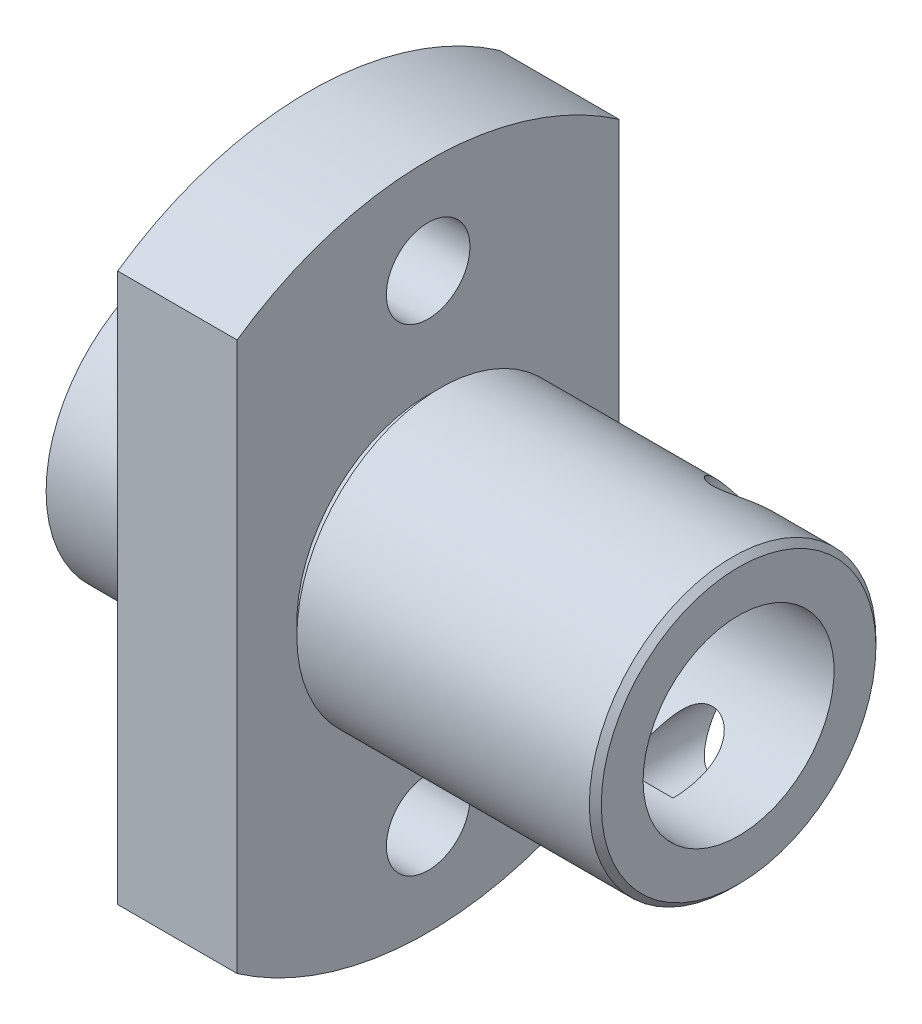
ISO-10303-21;
HEADER;
FILE_DESCRIPTION(('STEP AP214'),'2;1');
FILE_NAME('part.step','',(''),(''),'','','');
FILE_SCHEMA(('AUTOMOTIVE_DESIGN { 1 0 10303 214 1 1 1 1 }'));
ENDSEC;
DATA;
#1=APPLICATION_CONTEXT('core data for automotive mechanical design processes');
#2=APPLICATION_PROTOCOL_DEFINITION('international standard','automotive_design',2000,#1);
#3=PRODUCT_CONTEXT('',#1,'mechanical');
#4=PRODUCT('Part','Part','',(#3));
#5=PRODUCT_RELATED_PRODUCT_CATEGORY('part','',(#4));
#6=PRODUCT_DEFINITION_FORMATION('','',#4);
#7=PRODUCT_DEFINITION_CONTEXT('part definition',#1,'design');
#8=PRODUCT_DEFINITION('design','',#6,#7);
#9=PRODUCT_DEFINITION_SHAPE('','',#8);
#10=(LENGTH_UNIT() NAMED_UNIT(*) SI_UNIT(.MILLI.,.METRE.));
#11=(NAMED_UNIT(*) PLANE_ANGLE_UNIT() SI_UNIT($,.RADIAN.));
#12=(NAMED_UNIT(*) SI_UNIT($,.STERADIAN.) SOLID_ANGLE_UNIT());
#13=UNCERTAINTY_MEASURE_WITH_UNIT(LENGTH_MEASURE(1.E-05),#10,'distance_accuracy_value','');
#14=(GEOMETRIC_REPRESENTATION_CONTEXT(3) GLOBAL_UNCERTAINTY_ASSIGNED_CONTEXT((#13)) GLOBAL_UNIT_ASSIGNED_CONTEXT((#10,
#11,#12)) REPRESENTATION_CONTEXT('',''));
#15=CARTESIAN_POINT('',(0.,0.,0.));
#16=DIRECTION('',(0.,0.,1.));
#17=DIRECTION('',(1.,0.,0.));
#18=AXIS2_PLACEMENT_3D('',#15,#16,#17);
#19=CARTESIAN_POINT('',(5.,0.,0.));
#20=DIRECTION('',(1.,0.,0.));
#21=DIRECTION('',(0.,0.,-1.));
#22=AXIS2_PLACEMENT_3D('',#19,#20,#21);
#23=PLANE('',#22);
#24=CARTESIAN_POINT('',(5.,10.,0.));
#25=DIRECTION('',(1.,0.,0.));
#26=DIRECTION('',(0.,0.,-1.));
#27=AXIS2_PLACEMENT_3D('',#24,#25,#26);
#28=CIRCLE('',#27,1.75);
#29=CARTESIAN_POINT('',(5.,10.,-1.75));
#30=VERTEX_POINT('',#29);
#31=EDGE_CURVE('E180',#30,#30,#28,.T.);
#32=ORIENTED_EDGE('',*,*,#31,.F.);
#33=EDGE_LOOP('',(#32));
#34=FACE_BOUND('',#33,.T.);
#35=CARTESIAN_POINT('',(5.,0.,0.));
#36=DIRECTION('',(1.,0.,0.));
#37=DIRECTION('',(0.,0.,-1.));
#38=AXIS2_PLACEMENT_3D('',#35,#36,#37);
#39=CIRCLE('',#38,14.);
#40=CARTESIAN_POINT('',(5.,11.4891252930761,-8.));
#41=VERTEX_POINT('',#40);
#42=CARTESIAN_POINT('',(5.,11.4891252930761,8.));
#43=VERTEX_POINT('',#42);
#44=EDGE_CURVE('E182',#41,#43,#39,.T.);
#45=ORIENTED_EDGE('',*,*,#44,.T.);
#46=DIRECTION('',(0.,-1.,0.));
#47=VECTOR('',#46,1.);
#48=CARTESIAN_POINT('',(5.,11.4891252930761,8.));
#49=LINE('',#48,#47);
#50=CARTESIAN_POINT('',(5.,-11.4891252930761,8.));
#51=VERTEX_POINT('',#50);
#52=EDGE_CURVE('E187',#43,#51,#49,.T.);
#53=ORIENTED_EDGE('',*,*,#52,.T.);
#54=CARTESIAN_POINT('',(5.,0.,0.));
#55=DIRECTION('',(1.,0.,0.));
#56=DIRECTION('',(0.,0.,-1.));
#57=AXIS2_PLACEMENT_3D('',#54,#55,#56);
#58=CIRCLE('',#57,14.);
#59=CARTESIAN_POINT('',(5.,-11.4891252930761,-7.99999999999999));
#60=VERTEX_POINT('',#59);
#61=EDGE_CURVE('E186',#51,#60,#58,.T.);
#62=ORIENTED_EDGE('',*,*,#61,.T.);
#63=DIRECTION('',(0.,1.,0.));
#64=VECTOR('',#63,1.);
#65=CARTESIAN_POINT('',(5.,11.4891252930761,-8.));
#66=LINE('',#65,#64);
#67=EDGE_CURVE('E192',#60,#41,#66,.T.);
#68=ORIENTED_EDGE('',*,*,#67,.T.);
#69=EDGE_LOOP('',(#45,#53,#62,#68));
#70=FACE_BOUND('',#69,.T.);
#71=CARTESIAN_POINT('',(5.,-10.,0.));
#72=DIRECTION('',(1.,0.,0.));
#73=DIRECTION('',(0.,0.,1.));
#74=AXIS2_PLACEMENT_3D('',#71,#72,#73);
#75=CIRCLE('',#74,1.75);
#76=CARTESIAN_POINT('',(5.,-10.,1.75));
#77=VERTEX_POINT('',#76);
#78=EDGE_CURVE('E167',#77,#77,#75,.T.);
#79=ORIENTED_EDGE('',*,*,#78,.F.);
#80=EDGE_LOOP('',(#79));
#81=FACE_BOUND('',#80,.T.);
#82=CARTESIAN_POINT('',(5.,0.,0.));
#83=DIRECTION('',(1.,0.,0.));
#84=DIRECTION('',(0.,0.,-1.));
#85=AXIS2_PLACEMENT_3D('',#82,#83,#84);
#86=CIRCLE('',#85,5.5);
#87=CARTESIAN_POINT('',(5.,0.,-5.5));
#88=VERTEX_POINT('',#87);
#89=EDGE_CURVE('E278',#88,#88,#86,.T.);
#90=ORIENTED_EDGE('',*,*,#89,.F.);
#91=EDGE_LOOP('',(#90));
#92=FACE_BOUND('',#91,.T.);
#93=ADVANCED_FACE('F44',(#34,#70,#81,#92),#23,.T.);
#94=CARTESIAN_POINT('',(0.,0.,0.));
#95=DIRECTION('',(1.,0.,0.));
#96=DIRECTION('',(0.,0.,-1.));
#97=AXIS2_PLACEMENT_3D('',#94,#95,#96);
#98=PLANE('',#97);
#99=CARTESIAN_POINT('',(0.,0.,0.));
#100=DIRECTION('',(1.,0.,0.));
#101=DIRECTION('',(0.,0.,-1.));
#102=AXIS2_PLACEMENT_3D('',#99,#100,#101);
#103=CIRCLE('',#102,6.);
#104=CARTESIAN_POINT('',(0.,0.,-6.));
#105=VERTEX_POINT('',#104);
#106=EDGE_CURVE('E169',#105,#105,#103,.T.);
#107=ORIENTED_EDGE('',*,*,#106,.T.);
#108=EDGE_LOOP('',(#107));
#109=FACE_BOUND('',#108,.T.);
#110=CARTESIAN_POINT('',(0.,0.,0.));
#111=DIRECTION('',(1.,0.,0.));
#112=DIRECTION('',(0.,0.,-1.));
#113=AXIS2_PLACEMENT_3D('',#110,#111,#112);
#114=CIRCLE('',#113,14.);
#115=CARTESIAN_POINT('',(0.,11.4891252930761,-8.));
#116=VERTEX_POINT('',#115);
#117=CARTESIAN_POINT('',(0.,11.4891252930761,8.));
#118=VERTEX_POINT('',#117);
#119=EDGE_CURVE('E179',#116,#118,#114,.T.);
#120=ORIENTED_EDGE('',*,*,#119,.F.);
#121=DIRECTION('',(0.,1.,0.));
#122=VECTOR('',#121,1.);
#123=CARTESIAN_POINT('',(0.,11.4891252930761,-8.));
#124=LINE('',#123,#122);
#125=CARTESIAN_POINT('',(0.,-11.4891252930761,-7.99999999999999));
#126=VERTEX_POINT('',#125);
#127=EDGE_CURVE('E190',#126,#116,#124,.T.);
#128=ORIENTED_EDGE('',*,*,#127,.F.);
#129=CARTESIAN_POINT('',(0.,0.,0.));
#130=DIRECTION('',(1.,0.,0.));
#131=DIRECTION('',(0.,0.,-1.));
#132=AXIS2_PLACEMENT_3D('',#129,#130,#131);
#133=CIRCLE('',#132,14.);
#134=CARTESIAN_POINT('',(0.,-11.4891252930761,8.));
#135=VERTEX_POINT('',#134);
#136=EDGE_CURVE('E196',#135,#126,#133,.T.);
#137=ORIENTED_EDGE('',*,*,#136,.F.);
#138=DIRECTION('',(0.,-1.,0.));
#139=VECTOR('',#138,1.);
#140=CARTESIAN_POINT('',(0.,11.4891252930761,8.));
#141=LINE('',#140,#139);
#142=EDGE_CURVE('E198',#118,#135,#141,.T.);
#143=ORIENTED_EDGE('',*,*,#142,.F.);
#144=EDGE_LOOP('',(#120,#128,#137,#143));
#145=FACE_BOUND('',#144,.T.);
#146=CARTESIAN_POINT('',(0.,10.,0.));
#147=DIRECTION('',(1.,0.,0.));
#148=DIRECTION('',(0.,0.,-1.));
#149=AXIS2_PLACEMENT_3D('',#146,#147,#148);
#150=CIRCLE('',#149,1.75);
#151=CARTESIAN_POINT('',(0.,10.,-1.75));
#152=VERTEX_POINT('',#151);
#153=EDGE_CURVE('E173',#152,#152,#150,.T.);
#154=ORIENTED_EDGE('',*,*,#153,.T.);
#155=EDGE_LOOP('',(#154));
#156=FACE_BOUND('',#155,.T.);
#157=CARTESIAN_POINT('',(0.,-10.,0.));
#158=DIRECTION('',(1.,0.,0.));
#159=DIRECTION('',(0.,0.,1.));
#160=AXIS2_PLACEMENT_3D('',#157,#158,#159);
#161=CIRCLE('',#160,1.75);
#162=CARTESIAN_POINT('',(0.,-10.,1.75));
#163=VERTEX_POINT('',#162);
#164=EDGE_CURVE('E172',#163,#163,#161,.T.);
#165=ORIENTED_EDGE('',*,*,#164,.T.);
#166=EDGE_LOOP('',(#165));
#167=FACE_BOUND('',#166,.T.);
#168=ADVANCED_FACE('F235',(#109,#145,#156,#167),#98,.F.);
#169=CARTESIAN_POINT('',(5.,0.,0.));
#170=DIRECTION('',(-1.,0.,0.));
#171=DIRECTION('',(0.,0.,1.));
#172=AXIS2_PLACEMENT_3D('',#169,#170,#171);
#173=CYLINDRICAL_SURFACE('',#172,14.);
#174=ORIENTED_EDGE('',*,*,#119,.T.);
#175=DIRECTION('',(-1.,0.,0.));
#176=VECTOR('',#175,1.);
#177=CARTESIAN_POINT('',(5.,11.4891252930761,8.));
#178=LINE('',#177,#176);
#179=EDGE_CURVE('E209',#43,#118,#178,.T.);
#180=ORIENTED_EDGE('',*,*,#179,.F.);
#181=ORIENTED_EDGE('',*,*,#44,.F.);
#182=DIRECTION('',(-1.,0.,0.));
#183=VECTOR('',#182,1.);
#184=CARTESIAN_POINT('',(5.,11.4891252930761,-8.));
#185=LINE('',#184,#183);
#186=EDGE_CURVE('E194',#41,#116,#185,.T.);
#187=ORIENTED_EDGE('',*,*,#186,.T.);
#188=EDGE_LOOP('',(#174,#180,#181,#187));
#189=FACE_BOUND('',#188,.T.);
#190=ADVANCED_FACE('F237',(#189),#173,.T.);
#191=CARTESIAN_POINT('',(5.,11.4891252930761,8.));
#192=DIRECTION('',(0.,0.,-1.));
#193=DIRECTION('',(-1.,0.,0.));
#194=AXIS2_PLACEMENT_3D('',#191,#192,#193);
#195=PLANE('',#194);
#196=ORIENTED_EDGE('',*,*,#142,.T.);
#197=DIRECTION('',(-1.,0.,0.));
#198=VECTOR('',#197,1.);
#199=CARTESIAN_POINT('',(5.,-11.4891252930761,8.));
#200=LINE('',#199,#198);
#201=EDGE_CURVE('E207',#51,#135,#200,.T.);
#202=ORIENTED_EDGE('',*,*,#201,.F.);
#203=ORIENTED_EDGE('',*,*,#52,.F.);
#204=ORIENTED_EDGE('',*,*,#179,.T.);
#205=EDGE_LOOP('',(#196,#202,#203,#204));
#206=FACE_BOUND('',#205,.T.);
#207=ADVANCED_FACE('F253',(#206),#195,.F.);
#208=CARTESIAN_POINT('',(5.,0.,0.));
#209=DIRECTION('',(-1.,0.,0.));
#210=DIRECTION('',(0.,0.,1.));
#211=AXIS2_PLACEMENT_3D('',#208,#209,#210);
#212=CYLINDRICAL_SURFACE('',#211,14.);
#213=ORIENTED_EDGE('',*,*,#136,.T.);
#214=DIRECTION('',(-1.,0.,0.));
#215=VECTOR('',#214,1.);
#216=CARTESIAN_POINT('',(5.,-11.4891252930761,-7.99999999999999));
#217=LINE('',#216,#215);
#218=EDGE_CURVE('E203',#60,#126,#217,.T.);
#219=ORIENTED_EDGE('',*,*,#218,.F.);
#220=ORIENTED_EDGE('',*,*,#61,.F.);
#221=ORIENTED_EDGE('',*,*,#201,.T.);
#222=EDGE_LOOP('',(#213,#219,#220,#221));
#223=FACE_BOUND('',#222,.T.);
#224=ADVANCED_FACE('F252',(#223),#212,.T.);
#225=CARTESIAN_POINT('',(5.,11.4891252930761,-8.));
#226=DIRECTION('',(0.,0.,1.));
#227=DIRECTION('',(1.,0.,0.));
#228=AXIS2_PLACEMENT_3D('',#225,#226,#227);
#229=PLANE('',#228);
#230=ORIENTED_EDGE('',*,*,#127,.T.);
#231=ORIENTED_EDGE('',*,*,#186,.F.);
#232=ORIENTED_EDGE('',*,*,#67,.F.);
#233=ORIENTED_EDGE('',*,*,#218,.T.);
#234=EDGE_LOOP('',(#230,#231,#232,#233));
#235=FACE_BOUND('',#234,.T.);
#236=ADVANCED_FACE('F247',(#235),#229,.F.);
#237=CARTESIAN_POINT('',(5.,10.,0.));
#238=DIRECTION('',(-1.,0.,0.));
#239=DIRECTION('',(0.,0.,1.));
#240=AXIS2_PLACEMENT_3D('',#237,#238,#239);
#241=CYLINDRICAL_SURFACE('',#240,1.75);
#242=ORIENTED_EDGE('',*,*,#31,.T.);
#243=EDGE_LOOP('',(#242));
#244=FACE_BOUND('',#243,.T.);
#245=ORIENTED_EDGE('',*,*,#153,.F.);
#246=EDGE_LOOP('',(#245));
#247=FACE_BOUND('',#246,.T.);
#248=ADVANCED_FACE('F244',(#244,#247),#241,.F.);
#249=CARTESIAN_POINT('',(5.,-10.,0.));
#250=DIRECTION('',(-1.,0.,0.));
#251=DIRECTION('',(0.,0.,1.));
#252=AXIS2_PLACEMENT_3D('',#249,#250,#251);
#253=CYLINDRICAL_SURFACE('',#252,1.75);
#254=ORIENTED_EDGE('',*,*,#78,.T.);
#255=EDGE_LOOP('',(#254));
#256=FACE_BOUND('',#255,.T.);
#257=ORIENTED_EDGE('',*,*,#164,.F.);
#258=EDGE_LOOP('',(#257));
#259=FACE_BOUND('',#258,.T.);
#260=ADVANCED_FACE('F403',(#256,#259),#253,.F.);
#261=CARTESIAN_POINT('',(18.,0.,0.));
#262=DIRECTION('',(-1.,0.,0.));
#263=DIRECTION('',(0.,0.,1.));
#264=AXIS2_PLACEMENT_3D('',#261,#262,#263);
#265=CYLINDRICAL_SURFACE('',#264,6.);
#266=CARTESIAN_POINT('',(-5.,0.,0.));
#267=DIRECTION('',(-1.,0.,0.));
#268=DIRECTION('',(0.,0.,1.));
#269=AXIS2_PLACEMENT_3D('',#266,#267,#268);
#270=CIRCLE('',#269,6.);
#271=CARTESIAN_POINT('',(-5.,0.,6.));
#272=VERTEX_POINT('',#271);
#273=EDGE_CURVE('E161',#272,#272,#270,.T.);
#274=ORIENTED_EDGE('',*,*,#273,.F.);
#275=EDGE_LOOP('',(#274));
#276=FACE_BOUND('',#275,.T.);
#277=ORIENTED_EDGE('',*,*,#106,.F.);
#278=EDGE_LOOP('',(#277));
#279=FACE_BOUND('',#278,.T.);
#280=ADVANCED_FACE('F310',(#276,#279),#265,.T.);
#281=CARTESIAN_POINT('',(-5.,0.,0.));
#282=DIRECTION('',(-1.,0.,0.));
#283=DIRECTION('',(0.,0.,1.));
#284=AXIS2_PLACEMENT_3D('',#281,#282,#283);
#285=PLANE('',#284);
#286=ORIENTED_EDGE('',*,*,#273,.T.);
#287=EDGE_LOOP('',(#286));
#288=FACE_BOUND('',#287,.T.);
#289=CARTESIAN_POINT('',(-5.,0.,0.));
#290=DIRECTION('',(-1.,0.,0.));
#291=DIRECTION('',(0.,0.,1.));
#292=AXIS2_PLACEMENT_3D('',#289,#290,#291);
#293=CIRCLE('',#292,4.);
#294=CARTESIAN_POINT('',(-5.,0.,4.));
#295=VERTEX_POINT('',#294);
#296=EDGE_CURVE('E156',#295,#295,#293,.T.);
#297=ORIENTED_EDGE('',*,*,#296,.F.);
#298=EDGE_LOOP('',(#297));
#299=FACE_BOUND('',#298,.T.);
#300=ADVANCED_FACE('F332',(#288,#299),#285,.T.);
#301=CARTESIAN_POINT('',(18.,0.,0.));
#302=DIRECTION('',(-1.,0.,0.));
#303=DIRECTION('',(0.,0.,1.));
#304=AXIS2_PLACEMENT_3D('',#301,#302,#303);
#305=CYLINDRICAL_SURFACE('',#304,4.);
#306=DIRECTION('',(-1.,0.,0.));
#307=VECTOR('',#306,1.);
#308=CARTESIAN_POINT('',(18.,4.,0.));
#309=LINE('',#308,#307);
#310=CARTESIAN_POINT('',(12.75,4.,0.));
#311=VERTEX_POINT('',#310);
#312=CARTESIAN_POINT('',(15.25,4.,0.));
#313=VERTEX_POINT('',#312);
#314=EDGE_CURVE('E97',#311,#313,#309,.F.);
#315=ORIENTED_EDGE('',*,*,#314,.T.);
#316=CARTESIAN_POINT('',(15.25,4.,0.));
#317=CARTESIAN_POINT('',(15.2499958717718,3.99999992649772,-0.0527361300720566));
#318=CARTESIAN_POINT('',(15.2500005408976,3.99895693082857,-0.105466502347489));
#319=CARTESIAN_POINT('',(15.249991632197,3.99478730700551,-0.210845147935873));
#320=CARTESIAN_POINT('',(15.2499780542484,3.99166066488774,-0.263493420696252));
#321=CARTESIAN_POINT('',(15.2498561454578,3.97915443563328,-0.421260783049986));
#322=CARTESIAN_POINT('',(15.2496665720114,3.96664854906874,-0.526149478820891));
#323=CARTESIAN_POINT('',(15.2483282622251,3.93324252222453,-0.735485159372562));
#324=CARTESIAN_POINT('',(15.2471713221626,3.91227138205291,-0.839920660726293));
#325=CARTESIAN_POINT('',(15.2426248060089,3.86208456269373,-1.04671381767955));
#326=CARTESIAN_POINT('',(15.2392363307028,3.83287295247411,-1.14907247210998));
#327=CARTESIAN_POINT('',(15.2301936171397,3.77720606176655,-1.31828927240217));
#328=CARTESIAN_POINT('',(15.2256264435959,3.75291428234357,-1.38592336012236));
#329=CARTESIAN_POINT('',(15.213958228242,3.70080133285223,-1.51960990034069));
#330=CARTESIAN_POINT('',(15.2068571077068,3.67298005314594,-1.58566230363069));
#331=CARTESIAN_POINT('',(15.1893389354401,3.61410723717384,-1.71560395315428));
#332=CARTESIAN_POINT('',(15.1789331493096,3.58306691326716,-1.77949974431909));
#333=CARTESIAN_POINT('',(15.1538650573275,3.51801566628978,-1.90487621337323));
#334=CARTESIAN_POINT('',(15.1392045920237,3.48400603216268,-1.96635792255039));
#335=CARTESIAN_POINT('',(15.0991159202721,3.40240619118151,-2.1052257979995));
#336=CARTESIAN_POINT('',(15.0717521875508,3.3539044940483,-2.18154529372772));
#337=CARTESIAN_POINT('',(15.0051463283812,3.25451633676758,-2.32719890173738));
#338=CARTESIAN_POINT('',(14.9659199347494,3.20363311020634,-2.39654210495779));
#339=CARTESIAN_POINT('',(14.8846723374761,3.11541353714428,-2.50958180567701));
#340=CARTESIAN_POINT('',(14.8457971025443,3.0778683466234,-2.55535779278076));
#341=CARTESIAN_POINT('',(14.7592332636291,3.00539548029301,-2.64020774380455));
#342=CARTESIAN_POINT('',(14.7115556821605,2.9704646068162,-2.6792899731092));
#343=CARTESIAN_POINT('',(14.6167891840402,2.9116069798689,-2.74300672075442));
#344=CARTESIAN_POINT('',(14.5711303742156,2.88683043011403,-2.76897535360391));
#345=CARTESIAN_POINT('',(14.4744787502172,2.84233237551449,-2.81463401227608));
#346=CARTESIAN_POINT('',(14.4234877863927,2.82260912523113,-2.83432620659174));
#347=CARTESIAN_POINT('',(14.3170211559928,2.78957878398987,-2.86684445962153));
#348=CARTESIAN_POINT('',(14.2615217329528,2.77630865150894,-2.87963101323151));
#349=CARTESIAN_POINT('',(14.1480385433372,2.75746743650635,-2.89767997054823));
#350=CARTESIAN_POINT('',(14.0900557421111,2.75189338983756,-2.90294527109235));
#351=CARTESIAN_POINT('',(13.9795417509793,2.74906899731765,-2.905618554399));
#352=CARTESIAN_POINT('',(13.9270455764755,2.75104161322296,-2.90376000162648));
#353=CARTESIAN_POINT('',(13.8233075734245,2.76145432628439,-2.89385921039684));
#354=CARTESIAN_POINT('',(13.7720654634456,2.76989295837344,-2.88581837271768));
#355=CARTESIAN_POINT('',(13.6730881017287,2.79245528601857,-2.86398877322884));
#356=CARTESIAN_POINT('',(13.6253085565102,2.80648162153848,-2.85029831083604));
#357=CARTESIAN_POINT('',(13.5333854067702,2.83932973823793,-2.81757731391423));
#358=CARTESIAN_POINT('',(13.4892424033984,2.85815231017772,-2.79854589876456));
#359=CARTESIAN_POINT('',(13.4019408969989,2.90119162659219,-2.75392762472348));
#360=CARTESIAN_POINT('',(13.3591430779628,2.92571926518533,-2.72793838951407));
#361=CARTESIAN_POINT('',(13.2790160961007,2.97776229447344,-2.67103424256828));
#362=CARTESIAN_POINT('',(13.2416901359219,3.00527941862366,-2.64011646810767));
#363=CARTESIAN_POINT('',(13.1546197754162,3.07672351129036,-2.55697157799842));
#364=CARTESIAN_POINT('',(13.1084280280511,3.12178110750714,-2.50198995382196));
#365=CARTESIAN_POINT('',(13.0274332810639,3.21238966159539,-2.38455082372092));
#366=CARTESIAN_POINT('',(12.9926554748415,3.25794148460677,-2.32207719027414));
#367=CARTESIAN_POINT('',(12.9399084359625,3.33639914397337,-2.2072740990358));
#368=CARTESIAN_POINT('',(12.9199082844563,3.36970986546209,-2.15612220741631));
#369=CARTESIAN_POINT('',(12.884562274034,3.43461021343453,-2.05116055733202));
#370=CARTESIAN_POINT('',(12.8692189377478,3.46619889950588,-1.99734937659811));
#371=CARTESIAN_POINT('',(12.8423677861408,3.52724028135967,-1.88746830903749));
#372=CARTESIAN_POINT('',(12.8308679643351,3.55668842712328,-1.83139398340477));
#373=CARTESIAN_POINT('',(12.8110125593186,3.61308718472474,-1.7174533897862));
#374=CARTESIAN_POINT('',(12.8026580187724,3.64003696612404,-1.65958653444258));
#375=CARTESIAN_POINT('',(12.7843218652374,3.70606982264312,-1.50839110660854));
#376=CARTESIAN_POINT('',(12.7762037696302,3.74313200492755,-1.41394839903658));
#377=CARTESIAN_POINT('',(12.7640513835466,3.81003996756403,-1.22225970596819));
#378=CARTESIAN_POINT('',(12.7600197089538,3.83988111614865,-1.12501196576313));
#379=CARTESIAN_POINT('',(12.7543921868092,3.89206706736761,-0.928516044816215));
#380=CARTESIAN_POINT('',(12.7527951463972,3.91441553688456,-0.829268867874583));
#381=CARTESIAN_POINT('',(12.7508043671944,3.95147774576543,-0.629402743302346));
#382=CARTESIAN_POINT('',(12.7504099631019,3.9661957026081,-0.528784585060822));
#383=CARTESIAN_POINT('',(12.7500700723697,3.98471017902993,-0.356652912228881));
#384=CARTESIAN_POINT('',(12.7500262458686,3.99045008363416,-0.285342504116694));
#385=CARTESIAN_POINT('',(12.7500000050323,3.99809098923982,-0.142689674876128));
#386=CARTESIAN_POINT('',(12.750017442099,4.00000126155051,-0.0713477503050324));
#387=CARTESIAN_POINT('',(12.75,4.,0.));
#388=B_SPLINE_CURVE_WITH_KNOTS('',3,(#316,#317,#318,#319,#320,#321,#322,#323,#324,#325,#326,
#327,#328,#329,#330,#331,#332,#333,#334,#335,#336,#337,#338,#339,#340,#341,#342,#343,#344,#345,
#346,#347,#348,#349,#350,#351,#352,#353,#354,#355,#356,#357,#358,#359,#360,#361,#362,#363,#364,
#365,#366,#367,#368,#369,#370,#371,#372,#373,#374,#375,#376,#377,#378,#379,#380,#381,#382,#383,
#384,#385,#386,#387),.UNSPECIFIED.,.F.,.F.,(4,2,2,2,2,2,2,2,2,2,2,2,2,2,2,2,2,2,2,2,2,2,2,2,2,2,
2,2,2,2,2,2,2,2,2,4),(0.,0.158186575890239,0.316374211902784,0.632907849437155,0.95215339204688,
1.27124157313251,1.48714203333418,1.70304920175887,1.91822810409326,2.13331405977442,
2.41592582127969,2.69816440145334,2.90989856626433,3.12136936887778,3.29488642708836,
3.46834347046374,3.6427825724972,3.81715447055823,3.97407929429092,4.13096857257691,
4.28523606390296,4.43952900593834,4.60615404254622,4.77287621774716,5.02576934559468,
5.27921697487496,5.47166273284838,5.66421255475332,5.85716037413264,6.05017209974983,
6.35505285381412,6.6601286513734,6.96505492755688,7.26981248705652,7.48433859931071,
7.6983447265376),.UNSPECIFIED.);
#389=EDGE_CURVE('E102',#313,#311,#388,.T.);
#390=ORIENTED_EDGE('',*,*,#389,.T.);
#391=EDGE_LOOP('',(#315,#390));
#392=FACE_BOUND('',#391,.T.);
#393=DIRECTION('',(-1.,0.,0.));
#394=VECTOR('',#393,1.);
#395=CARTESIAN_POINT('',(18.,-4.,0.));
#396=LINE('',#395,#394);
#397=CARTESIAN_POINT('',(15.25,-4.,0.));
#398=VERTEX_POINT('',#397);
#399=CARTESIAN_POINT('',(12.75,-4.,0.));
#400=VERTEX_POINT('',#399);
#401=EDGE_CURVE('E103',#398,#400,#396,.T.);
#402=ORIENTED_EDGE('',*,*,#401,.T.);
#403=CARTESIAN_POINT('',(12.75,-4.,0.));
#404=CARTESIAN_POINT('',(12.7500041282282,-3.99999992649772,-0.0527361300720567));
#405=CARTESIAN_POINT('',(12.7499994591024,-3.99895693082857,-0.105466502347489));
#406=CARTESIAN_POINT('',(12.750008367803,-3.99478730700551,-0.210845147935873));
#407=CARTESIAN_POINT('',(12.7500219457516,-3.99166066488774,-0.263493420696252));
#408=CARTESIAN_POINT('',(12.7501438545422,-3.97915443563328,-0.421260783049986));
#409=CARTESIAN_POINT('',(12.7503334279886,-3.96664854906874,-0.526149478820891));
#410=CARTESIAN_POINT('',(12.7516717377749,-3.93324252222453,-0.735485159372562));
#411=CARTESIAN_POINT('',(12.7528286778374,-3.91227138205291,-0.839920660726293));
#412=CARTESIAN_POINT('',(12.7573751939911,-3.86208456269373,-1.04671381767955));
#413=CARTESIAN_POINT('',(12.7607636692972,-3.83287295247411,-1.14907247210998));
#414=CARTESIAN_POINT('',(12.7698063828603,-3.77720606176655,-1.31828927240217));
#415=CARTESIAN_POINT('',(12.7743735564041,-3.75291428234357,-1.38592336012236));
#416=CARTESIAN_POINT('',(12.786041771758,-3.70080133285223,-1.51960990034069));
#417=CARTESIAN_POINT('',(12.7931428922932,-3.67298005314594,-1.58566230363069));
#418=CARTESIAN_POINT('',(12.8106610645599,-3.61410723717384,-1.71560395315428));
#419=CARTESIAN_POINT('',(12.8210668506904,-3.58306691326716,-1.77949974431909));
#420=CARTESIAN_POINT('',(12.8461349426725,-3.51801566628978,-1.90487621337323));
#421=CARTESIAN_POINT('',(12.8607954079763,-3.48400603216268,-1.96635792255039));
#422=CARTESIAN_POINT('',(12.9008840797279,-3.40240619118151,-2.1052257979995));
#423=CARTESIAN_POINT('',(12.9282478124492,-3.3539044940483,-2.18154529372772));
#424=CARTESIAN_POINT('',(12.9948536716188,-3.25451633676758,-2.32719890173738));
#425=CARTESIAN_POINT('',(13.0340800652506,-3.20363311020634,-2.39654210495779));
#426=CARTESIAN_POINT('',(13.1153276625239,-3.11541353714428,-2.50958180567701));
#427=CARTESIAN_POINT('',(13.1542028974557,-3.0778683466234,-2.55535779278076));
#428=CARTESIAN_POINT('',(13.2407667363709,-3.00539548029301,-2.64020774380455));
#429=CARTESIAN_POINT('',(13.2884443178395,-2.9704646068162,-2.6792899731092));
#430=CARTESIAN_POINT('',(13.3832108159598,-2.9116069798689,-2.74300672075442));
#431=CARTESIAN_POINT('',(13.4288696257844,-2.88683043011403,-2.76897535360391));
#432=CARTESIAN_POINT('',(13.5255212497828,-2.84233237551449,-2.81463401227608));
#433=CARTESIAN_POINT('',(13.5765122136073,-2.82260912523113,-2.83432620659174));
#434=CARTESIAN_POINT('',(13.6829788440072,-2.78957878398987,-2.86684445962153));
#435=CARTESIAN_POINT('',(13.7384782670472,-2.77630865150894,-2.87963101323151));
#436=CARTESIAN_POINT('',(13.8519614566628,-2.75746743650635,-2.89767997054823));
#437=CARTESIAN_POINT('',(13.9099442578889,-2.75189338983756,-2.90294527109235));
#438=CARTESIAN_POINT('',(14.0204582490207,-2.74906899731765,-2.90561855439899));
#439=CARTESIAN_POINT('',(14.0729544235245,-2.75104161322296,-2.90376000162648));
#440=CARTESIAN_POINT('',(14.1766924265755,-2.76145432628439,-2.89385921039684));
#441=CARTESIAN_POINT('',(14.2279345365544,-2.76989295837344,-2.88581837271768));
#442=CARTESIAN_POINT('',(14.3269118982713,-2.79245528601857,-2.86398877322884));
#443=CARTESIAN_POINT('',(14.3746914434898,-2.80648162153848,-2.85029831083604));
#444=CARTESIAN_POINT('',(14.4666145932298,-2.83932973823793,-2.81757731391423));
#445=CARTESIAN_POINT('',(14.5107575966016,-2.85815231017772,-2.79854589876456));
#446=CARTESIAN_POINT('',(14.5980591030011,-2.90119162659219,-2.75392762472348));
#447=CARTESIAN_POINT('',(14.6408569220372,-2.92571926518533,-2.72793838951407));
#448=CARTESIAN_POINT('',(14.7209839038993,-2.97776229447344,-2.67103424256828));
#449=CARTESIAN_POINT('',(14.7583098640781,-3.00527941862366,-2.64011646810767));
#450=CARTESIAN_POINT('',(14.8453802245838,-3.07672351129036,-2.55697157799842));
#451=CARTESIAN_POINT('',(14.8915719719489,-3.12178110750714,-2.50198995382196));
#452=CARTESIAN_POINT('',(14.9725667189361,-3.21238966159539,-2.38455082372092));
#453=CARTESIAN_POINT('',(15.0073445251585,-3.25794148460677,-2.32207719027414));
#454=CARTESIAN_POINT('',(15.0600915640375,-3.33639914397337,-2.2072740990358));
#455=CARTESIAN_POINT('',(15.0800917155436,-3.36970986546209,-2.15612220741631));
#456=CARTESIAN_POINT('',(15.115437725966,-3.43461021343453,-2.05116055733202));
#457=CARTESIAN_POINT('',(15.1307810622522,-3.46619889950588,-1.99734937659811));
#458=CARTESIAN_POINT('',(15.1576322138592,-3.52724028135967,-1.88746830903749));
#459=CARTESIAN_POINT('',(15.1691320356649,-3.55668842712328,-1.83139398340477));
#460=CARTESIAN_POINT('',(15.1889874406814,-3.61308718472474,-1.7174533897862));
#461=CARTESIAN_POINT('',(15.1973419812276,-3.64003696612404,-1.65958653444258));
#462=CARTESIAN_POINT('',(15.2156781347626,-3.70606982264312,-1.50839110660854));
#463=CARTESIAN_POINT('',(15.2237962303698,-3.74313200492755,-1.41394839903658));
#464=CARTESIAN_POINT('',(15.2359486164534,-3.81003996756403,-1.22225970596819));
#465=CARTESIAN_POINT('',(15.2399802910462,-3.83988111614865,-1.12501196576313));
#466=CARTESIAN_POINT('',(15.2456078131908,-3.89206706736761,-0.928516044816215));
#467=CARTESIAN_POINT('',(15.2472048536028,-3.91441553688456,-0.829268867874583));
#468=CARTESIAN_POINT('',(15.2491956328056,-3.95147774576543,-0.629402743302346));
#469=CARTESIAN_POINT('',(15.2495900368981,-3.9661957026081,-0.528784585060822));
#470=CARTESIAN_POINT('',(15.2499299276302,-3.98471017902993,-0.356652912228881));
#471=CARTESIAN_POINT('',(15.2499737541314,-3.99045008363416,-0.285342504116694));
#472=CARTESIAN_POINT('',(15.2499999949677,-3.99809098923982,-0.142689674876128));
#473=CARTESIAN_POINT('',(15.249982557901,-4.00000126155051,-0.0713477503050324));
#474=CARTESIAN_POINT('',(15.25,-4.,0.));
#475=B_SPLINE_CURVE_WITH_KNOTS('',3,(#403,#404,#405,#406,#407,#408,#409,#410,#411,#412,#413,
#414,#415,#416,#417,#418,#419,#420,#421,#422,#423,#424,#425,#426,#427,#428,#429,#430,#431,#432,
#433,#434,#435,#436,#437,#438,#439,#440,#441,#442,#443,#444,#445,#446,#447,#448,#449,#450,#451,
#452,#453,#454,#455,#456,#457,#458,#459,#460,#461,#462,#463,#464,#465,#466,#467,#468,#469,#470,
#471,#472,#473,#474),.UNSPECIFIED.,.F.,.F.,(4,2,2,2,2,2,2,2,2,2,2,2,2,2,2,2,2,2,2,2,2,2,2,2,2,2,
2,2,2,2,2,2,2,2,2,4),(0.,0.158186575890239,0.316374211902784,0.632907849437155,
0.952153392046879,1.27124157313251,1.48714203333418,1.70304920175887,1.91822810409326,
2.13331405977442,2.41592582127969,2.69816440145334,2.90989856626433,3.12136936887778,
3.29488642708836,3.46834347046374,3.6427825724972,3.81715447055823,3.97407929429092,
4.13096857257691,4.28523606390296,4.43952900593834,4.60615404254622,4.77287621774716,
5.02576934559469,5.27921697487496,5.47166273284838,5.66421255475332,5.85716037413264,
6.05017209974983,6.35505285381412,6.6601286513734,6.96505492755688,7.26981248705652,
7.48433859931071,7.6983447265376),.UNSPECIFIED.);
#476=EDGE_CURVE('E151',#400,#398,#475,.T.);
#477=ORIENTED_EDGE('',*,*,#476,.T.);
#478=EDGE_LOOP('',(#402,#477));
#479=FACE_BOUND('',#478,.T.);
#480=ORIENTED_EDGE('',*,*,#296,.T.);
#481=EDGE_LOOP('',(#480));
#482=FACE_BOUND('',#481,.T.);
#483=CARTESIAN_POINT('',(18.,0.,0.));
#484=DIRECTION('',(-1.,0.,0.));
#485=DIRECTION('',(0.,0.,1.));
#486=AXIS2_PLACEMENT_3D('',#483,#484,#485);
#487=CIRCLE('',#486,4.);
#488=CARTESIAN_POINT('',(18.,0.,4.));
#489=VERTEX_POINT('',#488);
#490=EDGE_CURVE('E168',#489,#489,#487,.T.);
#491=ORIENTED_EDGE('',*,*,#490,.F.);
#492=EDGE_LOOP('',(#491));
#493=FACE_BOUND('',#492,.T.);
#494=ADVANCED_FACE('F107',(#392,#479,#482,#493),#305,.F.);
#495=CARTESIAN_POINT('',(5.5,0.,0.));
#496=DIRECTION('',(1.,0.,0.));
#497=DIRECTION('',(0.,0.,-1.));
#498=AXIS2_PLACEMENT_3D('',#495,#496,#497);
#499=CIRCLE('',#498,6.);
#500=CARTESIAN_POINT('',(5.5,0.,-6.));
#501=VERTEX_POINT('',#500);
#502=EDGE_CURVE('E110',#501,#501,#499,.T.);
#503=ORIENTED_EDGE('',*,*,#502,.T.);
#504=EDGE_LOOP('',(#503));
#505=FACE_BOUND('',#504,.T.);
#506=CARTESIAN_POINT('',(17.75,0.,0.));
#507=DIRECTION('',(-1.,0.,0.));
#508=DIRECTION('',(0.,0.,1.));
#509=AXIS2_PLACEMENT_3D('',#506,#507,#508);
#510=CIRCLE('',#509,6.);
#511=CARTESIAN_POINT('',(17.75,0.,6.));
#512=VERTEX_POINT('',#511);
#513=EDGE_CURVE('E53',#512,#512,#510,.T.);
#514=ORIENTED_EDGE('',*,*,#513,.T.);
#515=EDGE_LOOP('',(#514));
#516=FACE_BOUND('',#515,.T.);
#517=CARTESIAN_POINT('',(12.75,4.,-4.47213595499958));
#518=CARTESIAN_POINT('',(12.7499969645656,4.09780100307968,-4.38465205741136));
#519=CARTESIAN_POINT('',(12.7614509496688,4.19276687813077,-4.29388607453828));
#520=CARTESIAN_POINT('',(12.8037980254604,4.37467278396174,-4.10843374296698));
#521=CARTESIAN_POINT('',(12.8347682595193,4.46157938702526,-4.01373323606239));
#522=CARTESIAN_POINT('',(12.8945504490063,4.58533559608669,-3.87024471248214));
#523=CARTESIAN_POINT('',(12.9169374598632,4.62578875242599,-3.82177470993804));
#524=CARTESIAN_POINT('',(12.9661232625739,4.70408646531956,-3.72497481729845));
#525=CARTESIAN_POINT('',(12.9929205730136,4.74193189177188,-3.67664488568162));
#526=CARTESIAN_POINT('',(13.0508750335628,4.81475188812112,-3.58075100848191));
#527=CARTESIAN_POINT('',(13.0820172148108,4.84973568678859,-3.53318503313399));
#528=CARTESIAN_POINT('',(13.1489448233305,4.91675934400888,-3.43930195680749));
#529=CARTESIAN_POINT('',(13.1847268901682,4.94880130477439,-3.39298398100737));
#530=CARTESIAN_POINT('',(13.2588247951823,5.00759317160839,-3.30553994562067));
#531=CARTESIAN_POINT('',(13.2968058637204,5.03455439275757,-3.2642745703558));
#532=CARTESIAN_POINT('',(13.3779400626593,5.08528089702233,-3.18467369434054));
#533=CARTESIAN_POINT('',(13.4211043952808,5.10903901360631,-3.14634484370924));
#534=CARTESIAN_POINT('',(13.5140714812873,5.15285192351067,-3.07407271352745));
#535=CARTESIAN_POINT('',(13.5639696920032,5.17284113290462,-3.04020972798879));
#536=CARTESIAN_POINT('',(13.6704424600528,5.20704873198322,-2.98124245013556));
#537=CARTESIAN_POINT('',(13.7269741030062,5.22130183159096,-2.95608560974844));
#538=CARTESIAN_POINT('',(13.8197888211677,5.23740923335777,-2.9274031911319));
#539=CARTESIAN_POINT('',(13.8541591163672,5.24195995895122,-2.91922854257431));
#540=CARTESIAN_POINT('',(13.9239857233707,5.24817664327887,-2.90803788891123));
#541=CARTESIAN_POINT('',(13.959440897811,5.24984552448654,-2.90501665777192));
#542=CARTESIAN_POINT('',(14.0304704719407,5.25013412028445,-2.90449515135681));
#543=CARTESIAN_POINT('',(14.0660449710428,5.24874823965482,-2.90700500703167));
#544=CARTESIAN_POINT('',(14.1361954332539,5.24305809837125,-2.91725458210112));
#545=CARTESIAN_POINT('',(14.1707703497084,5.23875088654607,-2.9249995900958));
#546=CARTESIAN_POINT('',(14.248408707017,5.22587829704154,-2.94795079934144));
#547=CARTESIAN_POINT('',(14.2908573072671,5.21641648221874,-2.96470945749152));
#548=CARTESIAN_POINT('',(14.3721711230529,5.19405926809217,-3.00370697064183));
#549=CARTESIAN_POINT('',(14.4110274782376,5.18115566861921,-3.02595890400249));
#550=CARTESIAN_POINT('',(14.5095826010831,5.14331564832775,-3.09005360039155));
#551=CARTESIAN_POINT('',(14.5662219855623,5.11604032227657,-3.13516872319028));
#552=CARTESIAN_POINT('',(14.6713908866784,5.05612781138334,-3.23091293284581));
#553=CARTESIAN_POINT('',(14.7198964992894,5.02347536261574,-3.28155757417457));
#554=CARTESIAN_POINT('',(14.8034715148499,4.9588011690081,-3.37833989796019));
#555=CARTESIAN_POINT('',(14.8394699639217,4.92736494975941,-3.42407725859642));
#556=CARTESIAN_POINT('',(14.9068669213126,4.86157537626351,-3.51686268506997));
#557=CARTESIAN_POINT('',(14.9382624324846,4.82722014412708,-3.5639115813809));
#558=CARTESIAN_POINT('',(14.9967073591344,4.75578077334725,-3.65869829432241));
#559=CARTESIAN_POINT('',(15.0237534410018,4.71869457299835,-3.70643660910512));
#560=CARTESIAN_POINT('',(15.0735374603319,4.64195632814311,-3.80210617322342));
#561=CARTESIAN_POINT('',(15.0962737638466,4.60230331810585,-3.85003748872537));
#562=CARTESIAN_POINT('',(15.1594711367119,4.47660851160449,-3.99711992741739));
#563=CARTESIAN_POINT('',(15.192749880177,4.38647515830013,-4.09600523476152));
#564=CARTESIAN_POINT('',(15.2381633734617,4.19718646180282,-4.28974180722547));
#565=CARTESIAN_POINT('',(15.2503415273727,4.09805008133999,-4.38460096088937));
#566=CARTESIAN_POINT('',(15.2497409201727,3.92187330303624,-4.54189015387966));
#567=CARTESIAN_POINT('',(15.2429480157147,3.84633196678238,-4.60601662698525));
#568=CARTESIAN_POINT('',(15.2144075559092,3.6938815105127,-4.72914169293975));
#569=CARTESIAN_POINT('',(15.1926803059767,3.61697438562666,-4.78814712605292));
#570=CARTESIAN_POINT('',(15.1380138921842,3.4785456601998,-4.88934612082297));
#571=CARTESIAN_POINT('',(15.1078162508518,3.4167590689108,-4.93264946845256));
#572=CARTESIAN_POINT('',(15.0356190650035,3.2965066725088,-5.01381035854838));
#573=CARTESIAN_POINT('',(14.9936222961387,3.23804009027387,-5.05166917863353));
#574=CARTESIAN_POINT('',(14.8974624591729,3.12678447159949,-5.12128558746019));
#575=CARTESIAN_POINT('',(14.8432080932781,3.0740426800118,-5.15299388981701));
#576=CARTESIAN_POINT('',(14.7237006361917,2.97793343504746,-5.20912872485838));
#577=CARTESIAN_POINT('',(14.6584560257246,2.93455881185933,-5.23356083235123));
#578=CARTESIAN_POINT('',(14.5285941476958,2.8652082673961,-5.2718059995446));
#579=CARTESIAN_POINT('',(14.465101839406,2.83766723288824,-5.28661216735569));
#580=CARTESIAN_POINT('',(14.3334293101843,2.79329329640408,-5.31019317809477));
#581=CARTESIAN_POINT('',(14.2652518518629,2.77645414306373,-5.31897154232703));
#582=CARTESIAN_POINT('',(14.1326877333117,2.75541268685616,-5.32989933387319));
#583=CARTESIAN_POINT('',(14.0684976589798,2.75022614633407,-5.33256549301365));
#584=CARTESIAN_POINT('',(13.9400824530472,2.74978857701966,-5.33279141873395));
#585=CARTESIAN_POINT('',(13.8758573348421,2.75453497385609,-5.33035250842126));
#586=CARTESIAN_POINT('',(13.7509247006372,2.77347979926068,-5.32051848630899));
#587=CARTESIAN_POINT('',(13.6901691852753,2.78743139382714,-5.31325276951589));
#588=CARTESIAN_POINT('',(13.5720924993849,2.82389906475676,-5.29396036565472));
#589=CARTESIAN_POINT('',(13.5147713381861,2.84641516438531,-5.28193366565349));
#590=CARTESIAN_POINT('',(13.403950879841,2.8995130354954,-5.25297541089335));
#591=CARTESIAN_POINT('',(13.3505436907767,2.93023848043368,-5.23595589748393));
#592=CARTESIAN_POINT('',(13.2499216910297,2.99821551387123,-5.19732897564866));
#593=CARTESIAN_POINT('',(13.2027079353118,3.03546821167909,-5.17572078724358));
#594=CARTESIAN_POINT('',(13.1123785313712,3.11762054243484,-5.12668218661806));
#595=CARTESIAN_POINT('',(13.0697294411278,3.16286002583179,-5.09896441770659));
#596=CARTESIAN_POINT('',(12.9927154633515,3.25730445823376,-5.03915611823601));
#597=CARTESIAN_POINT('',(12.9583544986553,3.30651127036385,-5.00706352824203));
#598=CARTESIAN_POINT('',(12.8941832973253,3.41346598109048,-4.93486585261593));
#599=CARTESIAN_POINT('',(12.865451556978,3.47152028199311,-4.89426076891252));
#600=CARTESIAN_POINT('',(12.8179208778281,3.58867296696736,-4.80902070126806));
#601=CARTESIAN_POINT('',(12.7991237623549,3.6477715406418,-4.76438497933165));
#602=CARTESIAN_POINT('',(12.7729336418059,3.75625383674778,-4.67916021317654));
#603=CARTESIAN_POINT('',(12.7642089574921,3.80569867335225,-4.63904439061401));
#604=CARTESIAN_POINT('',(12.7527435864679,3.90365492355631,-4.55692576555353));
#605=CARTESIAN_POINT('',(12.7500014845992,3.95216655521048,-4.51492341170746));
#606=CARTESIAN_POINT('',(12.75,4.,-4.47213595499958));
#607=B_SPLINE_CURVE_WITH_KNOTS('',3,(#517,#518,#519,#520,#521,#522,#523,#524,#525,#526,#527,
#528,#529,#530,#531,#532,#533,#534,#535,#536,#537,#538,#539,#540,#541,#542,#543,#544,#545,#546,
#547,#548,#549,#550,#551,#552,#553,#554,#555,#556,#557,#558,#559,#560,#561,#562,#563,#564,#565,
#566,#567,#568,#569,#570,#571,#572,#573,#574,#575,#576,#577,#578,#579,#580,#581,#582,#583,#584,
#585,#586,#587,#588,#589,#590,#591,#592,#593,#594,#595,#596,#597,#598,#599,#600,#601,#602,#603,
#604,#605,#606),.UNSPECIFIED.,.T.,.F.,(4,2,2,2,2,2,2,2,2,2,2,2,2,2,2,2,2,2,2,2,2,2,2,2,2,2,2,2,
2,2,2,2,2,2,2,2,2,2,2,2,2,2,2,2,4),(0.,0.393426549583097,0.788418065835603,0.989212758668207,
1.18994014195652,1.38999231771017,1.58990040671312,1.77629548891224,1.96310092009309,
2.15290564244416,2.34154391003414,2.44797021840883,2.55428853652486,2.66080175317602,
2.76742273161113,2.90645713864282,3.0458258054802,3.27666985705048,3.50818086872239,
3.70637367568444,3.90469496573939,4.10316754162459,4.30171521372532,4.71345804979641,
5.1243529173774,5.42126720520744,5.71777859135473,5.96061582645141,6.20339598378152,
6.44804780933958,6.69251170470006,6.90367837500779,7.11472158141448,7.30713629462761,
7.49950114489081,7.68690670773729,7.87431277967258,8.06524200570452,8.25620371174515,
8.45959103740516,8.66307443985927,8.89156923566099,9.12010595319711,9.31257228417723,
9.50499308299955),.UNSPECIFIED.);
#608=CARTESIAN_POINT('',(12.75,4.,-4.47213595499958));
#609=VERTEX_POINT('',#608);
#610=EDGE_CURVE('E106',#609,#609,#607,.T.);
#611=ORIENTED_EDGE('',*,*,#610,.F.);
#612=EDGE_LOOP('',(#611));
#613=FACE_BOUND('',#612,.T.);
#614=CARTESIAN_POINT('',(12.75,-4.,-4.47213595499958));
#615=CARTESIAN_POINT('',(12.7500002145416,-3.92085433107299,-4.54292548300284));
#616=CARTESIAN_POINT('',(12.7574977970359,-3.8397858784752,-4.61162843621211));
#617=CARTESIAN_POINT('',(12.7898021345713,-3.67620745842755,-4.74304121776288));
#618=CARTESIAN_POINT('',(12.8145823266862,-3.5936998923468,-4.80576007555801));
#619=CARTESIAN_POINT('',(12.8748553691121,-3.45142393697006,-4.90849928578537));
#620=CARTESIAN_POINT('',(12.9061176022093,-3.39113043565862,-4.95027295100331));
#621=CARTESIAN_POINT('',(12.9800359445961,-3.27408374616302,-5.02845041034544));
#622=CARTESIAN_POINT('',(13.0226871995792,-3.2173290623231,-5.06485648204452));
#623=CARTESIAN_POINT('',(13.1196394479248,-3.1096347896726,-5.13168846059845));
#624=CARTESIAN_POINT('',(13.1740235346145,-3.05874087026285,-5.16206858130682));
#625=CARTESIAN_POINT('',(13.2932259970437,-2.9662462137856,-5.21576985551125));
#626=CARTESIAN_POINT('',(13.3580377521754,-2.92463961987594,-5.239095461091));
#627=CARTESIAN_POINT('',(13.4873737771169,-2.85792550477656,-5.27574946558705));
#628=CARTESIAN_POINT('',(13.5509210904669,-2.8314056226776,-5.28996310730346));
#629=CARTESIAN_POINT('',(13.6824689546851,-2.7890336644395,-5.31242635130218));
#630=CARTESIAN_POINT('',(13.750467030769,-2.77317571425728,-5.32067923776609));
#631=CARTESIAN_POINT('',(13.882763527323,-2.75386780736694,-5.3306958468127));
#632=CARTESIAN_POINT('',(13.9468908350813,-2.74948484457806,-5.33294780320393));
#633=CARTESIAN_POINT('',(14.0750275480414,-2.75061124006217,-5.33236715096759));
#634=CARTESIAN_POINT('',(14.1390369782816,-2.75611817481357,-5.32953578800861));
#635=CARTESIAN_POINT('',(14.2635374442989,-2.77650750419871,-5.318940786538));
#636=CARTESIAN_POINT('',(14.3240759453371,-2.7911639493131,-5.31129597921831));
#637=CARTESIAN_POINT('',(14.4415967729883,-2.82897359910958,-5.29125342869934));
#638=CARTESIAN_POINT('',(14.4985790794471,-2.8521268519408,-5.27885565856628));
#639=CARTESIAN_POINT('',(14.6087070290495,-2.90646309336199,-5.24913759882535));
#640=CARTESIAN_POINT('',(14.6617502552939,-2.9378007531057,-5.23172173757547));
#641=CARTESIAN_POINT('',(14.7615511531695,-3.00691019128017,-5.19230875899375));
#642=CARTESIAN_POINT('',(14.8083075528054,-3.04468326827587,-5.17031071685078));
#643=CARTESIAN_POINT('',(14.897715443683,-3.12788650673586,-5.1204322780434));
#644=CARTESIAN_POINT('',(14.9398803690748,-3.17366054061215,-5.09225604750668));
#645=CARTESIAN_POINT('',(15.0158495583843,-3.26905963355553,-5.0315454500596));
#646=CARTESIAN_POINT('',(15.0496507445024,-3.318686101493,-4.99900948556597));
#647=CARTESIAN_POINT('',(15.1126595877535,-3.42653585261753,-4.9258097503037));
#648=CARTESIAN_POINT('',(15.140762524713,-3.48505762606607,-4.88463838041369));
#649=CARTESIAN_POINT('',(15.1869898128589,-3.60303828557091,-4.79827938127622));
#650=CARTESIAN_POINT('',(15.2051073993032,-3.66249777891843,-4.75308905333071));
#651=CARTESIAN_POINT('',(15.2386482482062,-3.80938471447406,-4.63691862883247));
#652=CARTESIAN_POINT('',(15.2485978336831,-3.89652844698862,-4.56397664853715));
#653=CARTESIAN_POINT('',(15.2511311201386,-4.06665749632469,-4.41308690575389));
#654=CARTESIAN_POINT('',(15.2436766566088,-4.14963326596619,-4.33512850742628));
#655=CARTESIAN_POINT('',(15.2099986308039,-4.32984701174736,-4.15599569766965));
#656=CARTESIAN_POINT('',(15.1795206279277,-4.42541341104154,-4.05391939805171));
#657=CARTESIAN_POINT('',(15.1184607832116,-4.56034289094124,-3.89974252946522));
#658=CARTESIAN_POINT('',(15.0955209571688,-4.60395382643932,-3.8481231218968));
#659=CARTESIAN_POINT('',(15.0446295586147,-4.68823647399134,-3.74497897311953));
#660=CARTESIAN_POINT('',(15.0166797225617,-4.72890919759188,-3.69345420533993));
#661=CARTESIAN_POINT('',(14.9408591738213,-4.82628900337024,-3.56596379275655));
#662=CARTESIAN_POINT('',(14.8899221516243,-4.88113812816439,-3.49033777441372));
#663=CARTESIAN_POINT('',(14.8044429065592,-4.9575063003227,-3.38010972504728));
#664=CARTESIAN_POINT('',(14.7744746695586,-4.98195494741288,-3.34393942755626));
#665=CARTESIAN_POINT('',(14.7111909193609,-5.02871602475795,-3.27319489936288));
#666=CARTESIAN_POINT('',(14.6778776922285,-5.0510298938893,-3.23861960185943));
#667=CARTESIAN_POINT('',(14.6068016185016,-5.0936378612847,-3.17119449271055));
#668=CARTESIAN_POINT('',(14.5689642155906,-5.11388366966243,-3.13839192172577));
#669=CARTESIAN_POINT('',(14.4888417233904,-5.15129769223048,-3.07659413011536));
#670=CARTESIAN_POINT('',(14.4465591750833,-5.16846764965551,-3.04759675540808));
#671=CARTESIAN_POINT('',(14.3660170608548,-5.19580997989936,-3.00069087274651));
#672=CARTESIAN_POINT('',(14.3286284180608,-5.20669488606952,-2.98172390318771));
#673=CARTESIAN_POINT('',(14.2508315638712,-5.22522332079515,-2.94913459406614));
#674=CARTESIAN_POINT('',(14.2104297322727,-5.23287348122649,-2.93550132368771));
#675=CARTESIAN_POINT('',(14.1352159076703,-5.2431297764787,-2.91713567147807));
#676=CARTESIAN_POINT('',(14.1007939120095,-5.24641668864685,-2.91120674840431));
#677=CARTESIAN_POINT('',(14.0312999700808,-5.25009111433361,-2.90457556696148));
#678=CARTESIAN_POINT('',(13.9962285067083,-5.25048070165723,-2.90386957020411));
#679=CARTESIAN_POINT('',(13.9265082870061,-5.24832509233876,-2.9077633243902));
#680=CARTESIAN_POINT('',(13.8918592521728,-5.24578194823369,-2.91235936458657));
#681=CARTESIAN_POINT('',(13.8238534407454,-5.2380016041938,-2.92632905350419));
#682=CARTESIAN_POINT('',(13.7904980444126,-5.23276160748503,-2.93570766190023));
#683=CARTESIAN_POINT('',(13.7118917042706,-5.21725485726419,-2.96320605777549));
#684=CARTESIAN_POINT('',(13.6675902023618,-5.20579890384218,-2.98334589514401));
#685=CARTESIAN_POINT('',(13.5831316542751,-5.17927600365583,-3.02915933904938));
#686=CARTESIAN_POINT('',(13.5429862581647,-5.16419927978728,-3.05484790951203));
#687=CARTESIAN_POINT('',(13.4395864972632,-5.11959570106694,-3.12932904708476));
#688=CARTESIAN_POINT('',(13.3800468925727,-5.08738586676534,-3.18162116605438));
#689=CARTESIAN_POINT('',(13.2702274907384,-5.01695268815408,-3.29158072007975));
#690=CARTESIAN_POINT('',(13.2199760886051,-4.97871154495405,-3.34926385241248));
#691=CARTESIAN_POINT('',(13.135967414518,-4.90469266952845,-3.45650510990944));
#692=CARTESIAN_POINT('',(13.1008758890758,-4.869752587894,-3.50560957401916));
#693=CARTESIAN_POINT('',(13.0356111113506,-4.79677653176079,-3.60482042596223));
#694=CARTESIAN_POINT('',(13.0054408368246,-4.75873870358728,-3.65492739996365));
#695=CARTESIAN_POINT('',(12.949903907437,-4.67979697156894,-3.75547368978959));
#696=CARTESIAN_POINT('',(12.9245338765426,-4.63889510995844,-3.80591274602974));
#697=CARTESIAN_POINT('',(12.8786121374348,-4.55434944369178,-3.90669087269251));
#698=CARTESIAN_POINT('',(12.8580614117019,-4.51070508223547,-3.95702992065673));
#699=CARTESIAN_POINT('',(12.8112387655252,-4.39409874482622,-4.08697706415237));
#700=CARTESIAN_POINT('',(12.7888164537335,-4.31911774693108,-4.16621450678854));
#701=CARTESIAN_POINT('',(12.7582012860979,-4.16345664321122,-4.32177298901376));
#702=CARTESIAN_POINT('',(12.7499997756066,-4.08278003482069,-4.39809577475353));
#703=CARTESIAN_POINT('',(12.75,-4.,-4.47213595499958));
#704=B_SPLINE_CURVE_WITH_KNOTS('',3,(#614,#615,#616,#617,#618,#619,#620,#621,#622,#623,#624,
#625,#626,#627,#628,#629,#630,#631,#632,#633,#634,#635,#636,#637,#638,#639,#640,#641,#642,#643,
#644,#645,#646,#647,#648,#649,#650,#651,#652,#653,#654,#655,#656,#657,#658,#659,#660,#661,#662,
#663,#664,#665,#666,#667,#668,#669,#670,#671,#672,#673,#674,#675,#676,#677,#678,#679,#680,#681,
#682,#683,#684,#685,#686,#687,#688,#689,#690,#691,#692,#693,#694,#695,#696,#697,#698,#699,#700,
#701,#702,#703),.UNSPECIFIED.,.T.,.F.,(4,2,2,2,2,2,2,2,2,2,2,2,2,2,2,2,2,2,2,2,2,2,2,2,2,2,2,2,
2,2,2,2,2,2,2,2,2,2,2,2,2,2,2,2,4),(0.,0.318250176256382,0.636012285044734,0.874283112935395,
1.11245254507061,1.35236759387613,1.59213091552686,1.80192068186004,2.01159477252169,
2.20359965685745,2.39555749677329,2.58295283049873,2.77034922615968,2.96158173610931,
3.15285287954316,3.35696955483043,3.56116123233902,3.79091419540883,4.02082261772815,
4.36115699055605,4.70223836712015,5.12922717534952,5.34313252284315,5.55696387407046,
5.87511563197998,6.03385006494138,6.19247674310702,6.35421964153382,6.51587058034882,
6.64539005524477,6.77464268642548,6.87942280489903,6.98412791815946,7.08875979567982,
7.19350040110494,7.34262963335238,7.4921661763675,7.747363555515,8.00332864243854,
8.21227945119178,8.42135622689438,8.63028540688939,8.83925714296054,9.17232412705319,
9.50518833844157),.UNSPECIFIED.);
#705=CARTESIAN_POINT('',(12.75,-4.,-4.47213595499958));
#706=VERTEX_POINT('',#705);
#707=EDGE_CURVE('E115',#706,#706,#704,.T.);
#708=ORIENTED_EDGE('',*,*,#707,.F.);
#709=EDGE_LOOP('',(#708));
#710=FACE_BOUND('',#709,.T.);
#711=ADVANCED_FACE('F216',(#505,#516,#613,#710),#265,.T.);
#712=CARTESIAN_POINT('',(18.,0.,0.));
#713=DIRECTION('',(-1.,0.,0.));
#714=DIRECTION('',(0.,0.,1.));
#715=AXIS2_PLACEMENT_3D('',#712,#713,#714);
#716=PLANE('',#715);
#717=CARTESIAN_POINT('',(18.,0.,0.));
#718=DIRECTION('',(-1.,0.,0.));
#719=DIRECTION('',(0.,0.,1.));
#720=AXIS2_PLACEMENT_3D('',#717,#718,#719);
#721=CIRCLE('',#720,5.75);
#722=CARTESIAN_POINT('',(18.,0.,5.75));
#723=VERTEX_POINT('',#722);
#724=EDGE_CURVE('E11',#723,#723,#721,.F.);
#725=ORIENTED_EDGE('',*,*,#724,.T.);
#726=EDGE_LOOP('',(#725));
#727=FACE_BOUND('',#726,.T.);
#728=ORIENTED_EDGE('',*,*,#490,.T.);
#729=EDGE_LOOP('',(#728));
#730=FACE_BOUND('',#729,.T.);
#731=ADVANCED_FACE('F145',(#727,#730),#716,.F.);
#732=CARTESIAN_POINT('',(14.,-4.,0.));
#733=DIRECTION('',(0.,0.,1.));
#734=DIRECTION('',(1.,0.,0.));
#735=AXIS2_PLACEMENT_3D('',#732,#733,#734);
#736=PLANE('',#735);
#737=CARTESIAN_POINT('',(14.,-4.,0.));
#738=DIRECTION('',(0.,0.,-1.));
#739=DIRECTION('',(-1.,0.,0.));
#740=AXIS2_PLACEMENT_3D('',#737,#738,#739);
#741=CIRCLE('',#740,1.25);
#742=EDGE_CURVE('E70',#398,#400,#741,.T.);
#743=ORIENTED_EDGE('',*,*,#742,.T.);
#744=ORIENTED_EDGE('',*,*,#401,.F.);
#745=EDGE_LOOP('',(#743,#744));
#746=FACE_BOUND('',#745,.T.);
#747=ADVANCED_FACE('F138',(#746),#736,.F.);
#748=CARTESIAN_POINT('',(14.,-4.,-8.));
#749=DIRECTION('',(0.,0.,-1.));
#750=DIRECTION('',(-1.,0.,0.));
#751=AXIS2_PLACEMENT_3D('',#748,#749,#750);
#752=CYLINDRICAL_SURFACE('',#751,1.24999999999999);
#753=ORIENTED_EDGE('',*,*,#707,.T.);
#754=EDGE_LOOP('',(#753));
#755=FACE_BOUND('',#754,.T.);
#756=ORIENTED_EDGE('',*,*,#742,.F.);
#757=ORIENTED_EDGE('',*,*,#476,.F.);
#758=EDGE_LOOP('',(#756,#757));
#759=FACE_BOUND('',#758,.T.);
#760=ADVANCED_FACE('F142',(#755,#759),#752,.F.);
#761=CARTESIAN_POINT('',(14.,4.,0.));
#762=DIRECTION('',(0.,0.,1.));
#763=DIRECTION('',(1.,0.,0.));
#764=AXIS2_PLACEMENT_3D('',#761,#762,#763);
#765=PLANE('',#764);
#766=CARTESIAN_POINT('',(14.,4.,0.));
#767=DIRECTION('',(0.,0.,-1.));
#768=DIRECTION('',(-1.,0.,0.));
#769=AXIS2_PLACEMENT_3D('',#766,#767,#768);
#770=CIRCLE('',#769,1.25);
#771=EDGE_CURVE('E58',#311,#313,#770,.T.);
#772=ORIENTED_EDGE('',*,*,#771,.T.);
#773=ORIENTED_EDGE('',*,*,#314,.F.);
#774=EDGE_LOOP('',(#772,#773));
#775=FACE_BOUND('',#774,.T.);
#776=ADVANCED_FACE('F96',(#775),#765,.F.);
#777=CARTESIAN_POINT('',(14.,4.,-8.));
#778=DIRECTION('',(0.,0.,-1.));
#779=DIRECTION('',(-1.,0.,0.));
#780=AXIS2_PLACEMENT_3D('',#777,#778,#779);
#781=CYLINDRICAL_SURFACE('',#780,1.24999999999999);
#782=ORIENTED_EDGE('',*,*,#610,.T.);
#783=EDGE_LOOP('',(#782));
#784=FACE_BOUND('',#783,.T.);
#785=ORIENTED_EDGE('',*,*,#771,.F.);
#786=ORIENTED_EDGE('',*,*,#389,.F.);
#787=EDGE_LOOP('',(#785,#786));
#788=FACE_BOUND('',#787,.T.);
#789=ADVANCED_FACE('F104',(#784,#788),#781,.F.);
#790=CARTESIAN_POINT('',(17.75,0.,0.));
#791=DIRECTION('',(-1.,0.,0.));
#792=DIRECTION('',(0.,0.,1.));
#793=AXIS2_PLACEMENT_3D('',#790,#791,#792);
#794=CONICAL_SURFACE('',#793,6.,0.785398163397454);
#795=ORIENTED_EDGE('',*,*,#724,.F.);
#796=EDGE_LOOP('',(#795));
#797=FACE_BOUND('',#796,.T.);
#798=ORIENTED_EDGE('',*,*,#513,.F.);
#799=EDGE_LOOP('',(#798));
#800=FACE_BOUND('',#799,.T.);
#801=ADVANCED_FACE('F48',(#797,#800),#794,.T.);
#802=CARTESIAN_POINT('',(5.5,0.,0.));
#803=DIRECTION('',(1.,0.,0.));
#804=DIRECTION('',(0.,0.,-1.));
#805=AXIS2_PLACEMENT_3D('',#802,#803,#804);
#806=PLANE('',#805);
#807=CARTESIAN_POINT('',(5.5,0.,0.));
#808=DIRECTION('',(1.,0.,0.));
#809=DIRECTION('',(0.,0.,-1.));
#810=AXIS2_PLACEMENT_3D('',#807,#808,#809);
#811=CIRCLE('',#810,5.5);
#812=CARTESIAN_POINT('',(5.5,0.,-5.5));
#813=VERTEX_POINT('',#812);
#814=EDGE_CURVE('E285',#813,#813,#811,.T.);
#815=ORIENTED_EDGE('',*,*,#814,.T.);
#816=EDGE_LOOP('',(#815));
#817=FACE_BOUND('',#816,.T.);
#818=ORIENTED_EDGE('',*,*,#502,.F.);
#819=EDGE_LOOP('',(#818));
#820=FACE_BOUND('',#819,.T.);
#821=ADVANCED_FACE('F225',(#817,#820),#806,.F.);
#822=CARTESIAN_POINT('',(5.,0.,0.));
#823=DIRECTION('',(1.,0.,0.));
#824=DIRECTION('',(0.,0.,-1.));
#825=AXIS2_PLACEMENT_3D('',#822,#823,#824);
#826=CYLINDRICAL_SURFACE('',#825,5.5);
#827=ORIENTED_EDGE('',*,*,#89,.T.);
#828=EDGE_LOOP('',(#827));
#829=FACE_BOUND('',#828,.T.);
#830=ORIENTED_EDGE('',*,*,#814,.F.);
#831=EDGE_LOOP('',(#830));
#832=FACE_BOUND('',#831,.T.);
#833=ADVANCED_FACE('F230',(#829,#832),#826,.T.);
#834=CLOSED_SHELL('',(#93,#168,#190,#207,#224,#236,#248,#260,#280,#300,#494,#711,#731,#747,#760,
#776,#789,#801,#821,#833));
#835=MANIFOLD_SOLID_BREP('B2',#834);
#836=ADVANCED_BREP_SHAPE_REPRESENTATION('',(#18,#835),#14);
#837=SHAPE_DEFINITION_REPRESENTATION(#9,#836);
ENDSEC;
END-ISO-10303-21;
